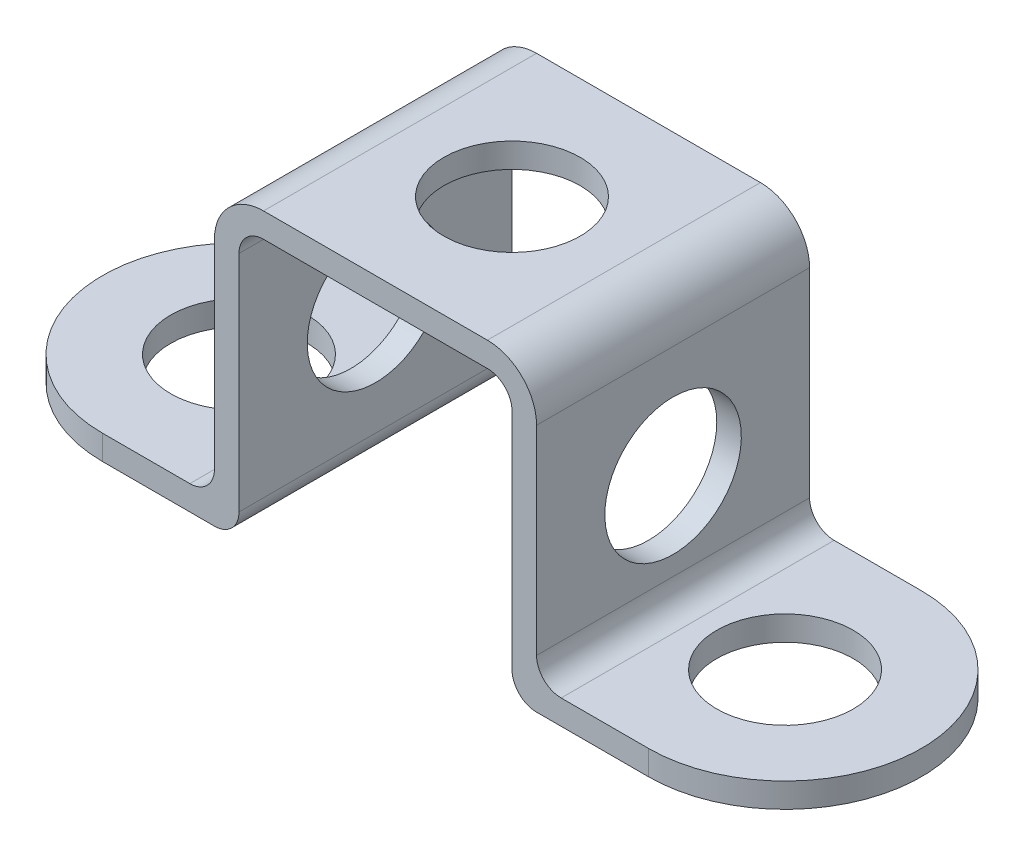
ISO-10303-21;
HEADER;
FILE_DESCRIPTION(('STEP AP214'),'2;1');
FILE_NAME('part.step','',(''),(''),'','','');
FILE_SCHEMA(('AUTOMOTIVE_DESIGN { 1 0 10303 214 1 1 1 1 }'));
ENDSEC;
DATA;
#1=APPLICATION_CONTEXT('core data for automotive mechanical design processes');
#2=APPLICATION_PROTOCOL_DEFINITION('international standard','automotive_design',2000,#1);
#3=PRODUCT_CONTEXT('',#1,'mechanical');
#4=PRODUCT('Part','Part','',(#3));
#5=PRODUCT_RELATED_PRODUCT_CATEGORY('part','',(#4));
#6=PRODUCT_DEFINITION_FORMATION('','',#4);
#7=PRODUCT_DEFINITION_CONTEXT('part definition',#1,'design');
#8=PRODUCT_DEFINITION('design','',#6,#7);
#9=PRODUCT_DEFINITION_SHAPE('','',#8);
#10=(LENGTH_UNIT() NAMED_UNIT(*) SI_UNIT(.MILLI.,.METRE.));
#11=(NAMED_UNIT(*) PLANE_ANGLE_UNIT() SI_UNIT($,.RADIAN.));
#12=(NAMED_UNIT(*) SI_UNIT($,.STERADIAN.) SOLID_ANGLE_UNIT());
#13=UNCERTAINTY_MEASURE_WITH_UNIT(LENGTH_MEASURE(1.E-05),#10,'distance_accuracy_value','');
#14=(GEOMETRIC_REPRESENTATION_CONTEXT(3) GLOBAL_UNCERTAINTY_ASSIGNED_CONTEXT((#13)) GLOBAL_UNIT_ASSIGNED_CONTEXT((#10,
#11,#12)) REPRESENTATION_CONTEXT('',''));
#15=CARTESIAN_POINT('',(0.,0.,0.));
#16=DIRECTION('',(0.,0.,1.));
#17=DIRECTION('',(1.,0.,0.));
#18=AXIS2_PLACEMENT_3D('',#15,#16,#17);
#19=CARTESIAN_POINT('',(4.1,9.1,0.));
#20=DIRECTION('',(0.,0.,-1.));
#21=DIRECTION('',(-1.,0.,0.));
#22=AXIS2_PLACEMENT_3D('',#19,#20,#21);
#23=PLANE('',#22);
#24=DIRECTION('',(0.,1.,0.));
#25=VECTOR('',#24,1.);
#26=CARTESIAN_POINT('',(10.,0.,0.));
#27=LINE('',#26,#25);
#28=CARTESIAN_POINT('',(10.,0.,0.));
#29=VERTEX_POINT('',#28);
#30=CARTESIAN_POINT('',(10.,0.900000000000003,0.));
#31=VERTEX_POINT('',#30);
#32=EDGE_CURVE('E236',#29,#31,#27,.T.);
#33=ORIENTED_EDGE('',*,*,#32,.T.);
#34=DIRECTION('',(-1.,0.,0.));
#35=VECTOR('',#34,1.);
#36=CARTESIAN_POINT('',(5.90000000000001,0.9,0.));
#37=LINE('',#36,#35);
#38=CARTESIAN_POINT('',(6.80000000000001,0.9,0.));
#39=VERTEX_POINT('',#38);
#40=EDGE_CURVE('E354',#31,#39,#37,.T.);
#41=ORIENTED_EDGE('',*,*,#40,.T.);
#42=CARTESIAN_POINT('',(6.80000000000001,1.8,0.));
#43=DIRECTION('',(0.,0.,-1.));
#44=DIRECTION('',(-1.,0.,0.));
#45=AXIS2_PLACEMENT_3D('',#42,#43,#44);
#46=CIRCLE('',#45,0.9);
#47=CARTESIAN_POINT('',(5.90000000000001,1.8,0.));
#48=VERTEX_POINT('',#47);
#49=EDGE_CURVE('E290',#39,#48,#46,.T.);
#50=ORIENTED_EDGE('',*,*,#49,.T.);
#51=DIRECTION('',(0.,1.,0.));
#52=VECTOR('',#51,1.);
#53=CARTESIAN_POINT('',(5.9,9.1,0.));
#54=LINE('',#53,#52);
#55=CARTESIAN_POINT('',(5.9,9.1,0.));
#56=VERTEX_POINT('',#55);
#57=EDGE_CURVE('E356',#48,#56,#54,.T.);
#58=ORIENTED_EDGE('',*,*,#57,.T.);
#59=CARTESIAN_POINT('',(4.1,9.1,0.));
#60=DIRECTION('',(0.,0.,1.));
#61=DIRECTION('',(-1.,0.,0.));
#62=AXIS2_PLACEMENT_3D('',#59,#60,#61);
#63=CIRCLE('',#62,1.8);
#64=CARTESIAN_POINT('',(4.09999999999999,10.9,0.));
#65=VERTEX_POINT('',#64);
#66=EDGE_CURVE('E359',#56,#65,#63,.T.);
#67=ORIENTED_EDGE('',*,*,#66,.T.);
#68=DIRECTION('',(-1.,0.,0.));
#69=VECTOR('',#68,1.);
#70=CARTESIAN_POINT('',(-4.09999999999999,10.9,0.));
#71=LINE('',#70,#69);
#72=CARTESIAN_POINT('',(-4.09999999999999,10.9,0.));
#73=VERTEX_POINT('',#72);
#74=EDGE_CURVE('E362',#65,#73,#71,.T.);
#75=ORIENTED_EDGE('',*,*,#74,.T.);
#76=CARTESIAN_POINT('',(-4.1,9.1,0.));
#77=DIRECTION('',(0.,0.,1.));
#78=DIRECTION('',(1.,0.,0.));
#79=AXIS2_PLACEMENT_3D('',#76,#77,#78);
#80=CIRCLE('',#79,1.8);
#81=CARTESIAN_POINT('',(-5.9,9.09999999999999,0.));
#82=VERTEX_POINT('',#81);
#83=EDGE_CURVE('E365',#73,#82,#80,.T.);
#84=ORIENTED_EDGE('',*,*,#83,.T.);
#85=DIRECTION('',(0.,-1.,0.));
#86=VECTOR('',#85,1.);
#87=CARTESIAN_POINT('',(-5.9,9.09999999999999,0.));
#88=LINE('',#87,#86);
#89=CARTESIAN_POINT('',(-5.9,1.80000000000001,0.));
#90=VERTEX_POINT('',#89);
#91=EDGE_CURVE('E301',#82,#90,#88,.T.);
#92=ORIENTED_EDGE('',*,*,#91,.T.);
#93=CARTESIAN_POINT('',(-6.8,1.80000000000001,0.));
#94=DIRECTION('',(0.,0.,-1.));
#95=DIRECTION('',(-1.,0.,0.));
#96=AXIS2_PLACEMENT_3D('',#93,#94,#95);
#97=CIRCLE('',#96,0.9);
#98=CARTESIAN_POINT('',(-6.8,0.900000000000006,0.));
#99=VERTEX_POINT('',#98);
#100=EDGE_CURVE('E97',#90,#99,#97,.T.);
#101=ORIENTED_EDGE('',*,*,#100,.T.);
#102=DIRECTION('',(-1.,0.,0.));
#103=VECTOR('',#102,1.);
#104=CARTESIAN_POINT('',(-5.9,0.900000000000007,0.));
#105=LINE('',#104,#103);
#106=CARTESIAN_POINT('',(-10.,0.900000000000003,0.));
#107=VERTEX_POINT('',#106);
#108=EDGE_CURVE('E298',#99,#107,#105,.T.);
#109=ORIENTED_EDGE('',*,*,#108,.T.);
#110=DIRECTION('',(0.,1.,0.));
#111=VECTOR('',#110,1.);
#112=CARTESIAN_POINT('',(-10.,0.,0.));
#113=LINE('',#112,#111);
#114=CARTESIAN_POINT('',(-10.,0.,0.));
#115=VERTEX_POINT('',#114);
#116=EDGE_CURVE('E399',#115,#107,#113,.T.);
#117=ORIENTED_EDGE('',*,*,#116,.F.);
#118=DIRECTION('',(1.,0.,0.));
#119=VECTOR('',#118,1.);
#120=CARTESIAN_POINT('',(-5.90000000000001,0.,0.));
#121=LINE('',#120,#119);
#122=CARTESIAN_POINT('',(-5.90000000000001,0.,0.));
#123=VERTEX_POINT('',#122);
#124=EDGE_CURVE('E309',#115,#123,#121,.T.);
#125=ORIENTED_EDGE('',*,*,#124,.T.);
#126=CARTESIAN_POINT('',(-5.9,0.9,0.));
#127=DIRECTION('',(0.,0.,1.));
#128=DIRECTION('',(-1.,0.,0.));
#129=AXIS2_PLACEMENT_3D('',#126,#127,#128);
#130=CIRCLE('',#129,0.9);
#131=CARTESIAN_POINT('',(-5.,0.900000000000006,0.));
#132=VERTEX_POINT('',#131);
#133=EDGE_CURVE('E369',#123,#132,#130,.T.);
#134=ORIENTED_EDGE('',*,*,#133,.T.);
#135=DIRECTION('',(0.,1.,0.));
#136=VECTOR('',#135,1.);
#137=CARTESIAN_POINT('',(-5.,9.09999999999999,0.));
#138=LINE('',#137,#136);
#139=CARTESIAN_POINT('',(-5.,9.09999999999999,0.));
#140=VERTEX_POINT('',#139);
#141=EDGE_CURVE('E372',#132,#140,#138,.T.);
#142=ORIENTED_EDGE('',*,*,#141,.T.);
#143=CARTESIAN_POINT('',(-4.1,9.1,0.));
#144=DIRECTION('',(0.,0.,-1.));
#145=DIRECTION('',(1.,0.,0.));
#146=AXIS2_PLACEMENT_3D('',#143,#144,#145);
#147=CIRCLE('',#146,0.9);
#148=CARTESIAN_POINT('',(-4.09999999999999,10.,0.));
#149=VERTEX_POINT('',#148);
#150=EDGE_CURVE('E375',#140,#149,#147,.T.);
#151=ORIENTED_EDGE('',*,*,#150,.T.);
#152=DIRECTION('',(1.,0.,0.));
#153=VECTOR('',#152,1.);
#154=CARTESIAN_POINT('',(-4.09999999999999,10.,0.));
#155=LINE('',#154,#153);
#156=CARTESIAN_POINT('',(4.09999999999999,10.,0.));
#157=VERTEX_POINT('',#156);
#158=EDGE_CURVE('E378',#149,#157,#155,.T.);
#159=ORIENTED_EDGE('',*,*,#158,.T.);
#160=CARTESIAN_POINT('',(4.1,9.1,0.));
#161=DIRECTION('',(0.,0.,-1.));
#162=DIRECTION('',(-1.,0.,0.));
#163=AXIS2_PLACEMENT_3D('',#160,#161,#162);
#164=CIRCLE('',#163,0.9);
#165=CARTESIAN_POINT('',(5.,9.1,0.));
#166=VERTEX_POINT('',#165);
#167=EDGE_CURVE('E381',#157,#166,#164,.T.);
#168=ORIENTED_EDGE('',*,*,#167,.T.);
#169=DIRECTION('',(0.,-1.,0.));
#170=VECTOR('',#169,1.);
#171=CARTESIAN_POINT('',(5.,9.1,0.));
#172=LINE('',#171,#170);
#173=CARTESIAN_POINT('',(5.,0.900000000000006,0.));
#174=VERTEX_POINT('',#173);
#175=EDGE_CURVE('E250',#166,#174,#172,.T.);
#176=ORIENTED_EDGE('',*,*,#175,.T.);
#177=CARTESIAN_POINT('',(5.9,0.9,0.));
#178=DIRECTION('',(0.,0.,1.));
#179=DIRECTION('',(1.,0.,0.));
#180=AXIS2_PLACEMENT_3D('',#177,#178,#179);
#181=CIRCLE('',#180,0.9);
#182=CARTESIAN_POINT('',(5.90000000000001,0.,0.));
#183=VERTEX_POINT('',#182);
#184=EDGE_CURVE('E245',#174,#183,#181,.T.);
#185=ORIENTED_EDGE('',*,*,#184,.T.);
#186=DIRECTION('',(1.,0.,0.));
#187=VECTOR('',#186,1.);
#188=CARTESIAN_POINT('',(5.90000000000001,0.,0.));
#189=LINE('',#188,#187);
#190=EDGE_CURVE('E230',#183,#29,#189,.T.);
#191=ORIENTED_EDGE('',*,*,#190,.T.);
#192=EDGE_LOOP('',(#33,#41,#50,#58,#67,#75,#84,#92,#101,#109,#117,#125,#134,#142,#151,#159,#168,
#176,#185,#191));
#193=FACE_BOUND('',#192,.T.);
#194=ADVANCED_FACE('F89',(#193),#23,.F.);
#195=CARTESIAN_POINT('',(4.1,9.1,-10.));
#196=DIRECTION('',(0.,0.,-1.));
#197=DIRECTION('',(-1.,0.,0.));
#198=AXIS2_PLACEMENT_3D('',#195,#196,#197);
#199=PLANE('',#198);
#200=DIRECTION('',(-1.,0.,0.));
#201=VECTOR('',#200,1.);
#202=CARTESIAN_POINT('',(5.90000000000001,0.9,-10.));
#203=LINE('',#202,#201);
#204=CARTESIAN_POINT('',(10.,0.9,-10.));
#205=VERTEX_POINT('',#204);
#206=CARTESIAN_POINT('',(6.80000000000001,0.9,-10.));
#207=VERTEX_POINT('',#206);
#208=EDGE_CURVE('E246',#205,#207,#203,.T.);
#209=ORIENTED_EDGE('',*,*,#208,.F.);
#210=DIRECTION('',(0.,1.,0.));
#211=VECTOR('',#210,1.);
#212=CARTESIAN_POINT('',(10.,0.,-10.));
#213=LINE('',#212,#211);
#214=CARTESIAN_POINT('',(10.,0.,-10.));
#215=VERTEX_POINT('',#214);
#216=EDGE_CURVE('E104',#215,#205,#213,.T.);
#217=ORIENTED_EDGE('',*,*,#216,.F.);
#218=DIRECTION('',(1.,0.,0.));
#219=VECTOR('',#218,1.);
#220=CARTESIAN_POINT('',(5.90000000000001,0.,-10.));
#221=LINE('',#220,#219);
#222=CARTESIAN_POINT('',(5.90000000000001,0.,-10.));
#223=VERTEX_POINT('',#222);
#224=EDGE_CURVE('E232',#223,#215,#221,.T.);
#225=ORIENTED_EDGE('',*,*,#224,.F.);
#226=CARTESIAN_POINT('',(5.9,0.9,-10.));
#227=DIRECTION('',(0.,0.,1.));
#228=DIRECTION('',(1.,0.,0.));
#229=AXIS2_PLACEMENT_3D('',#226,#227,#228);
#230=CIRCLE('',#229,0.9);
#231=CARTESIAN_POINT('',(5.,0.900000000000006,-10.));
#232=VERTEX_POINT('',#231);
#233=EDGE_CURVE('E350',#232,#223,#230,.T.);
#234=ORIENTED_EDGE('',*,*,#233,.F.);
#235=DIRECTION('',(0.,-1.,0.));
#236=VECTOR('',#235,1.);
#237=CARTESIAN_POINT('',(5.,9.1,-10.));
#238=LINE('',#237,#236);
#239=CARTESIAN_POINT('',(5.,9.1,-10.));
#240=VERTEX_POINT('',#239);
#241=EDGE_CURVE('E347',#240,#232,#238,.T.);
#242=ORIENTED_EDGE('',*,*,#241,.F.);
#243=CARTESIAN_POINT('',(4.1,9.1,-10.));
#244=DIRECTION('',(0.,0.,-1.));
#245=DIRECTION('',(-1.,0.,0.));
#246=AXIS2_PLACEMENT_3D('',#243,#244,#245);
#247=CIRCLE('',#246,0.9);
#248=CARTESIAN_POINT('',(4.09999999999999,10.,-10.));
#249=VERTEX_POINT('',#248);
#250=EDGE_CURVE('E344',#249,#240,#247,.T.);
#251=ORIENTED_EDGE('',*,*,#250,.F.);
#252=DIRECTION('',(1.,0.,0.));
#253=VECTOR('',#252,1.);
#254=CARTESIAN_POINT('',(-4.09999999999999,10.,-10.));
#255=LINE('',#254,#253);
#256=CARTESIAN_POINT('',(-4.09999999999999,10.,-10.));
#257=VERTEX_POINT('',#256);
#258=EDGE_CURVE('E341',#257,#249,#255,.T.);
#259=ORIENTED_EDGE('',*,*,#258,.F.);
#260=CARTESIAN_POINT('',(-4.1,9.1,-10.));
#261=DIRECTION('',(0.,0.,-1.));
#262=DIRECTION('',(1.,0.,0.));
#263=AXIS2_PLACEMENT_3D('',#260,#261,#262);
#264=CIRCLE('',#263,0.9);
#265=CARTESIAN_POINT('',(-5.,9.09999999999999,-10.));
#266=VERTEX_POINT('',#265);
#267=EDGE_CURVE('E338',#266,#257,#264,.T.);
#268=ORIENTED_EDGE('',*,*,#267,.F.);
#269=DIRECTION('',(0.,1.,0.));
#270=VECTOR('',#269,1.);
#271=CARTESIAN_POINT('',(-5.,9.09999999999999,-10.));
#272=LINE('',#271,#270);
#273=CARTESIAN_POINT('',(-5.,0.900000000000006,-10.));
#274=VERTEX_POINT('',#273);
#275=EDGE_CURVE('E335',#274,#266,#272,.T.);
#276=ORIENTED_EDGE('',*,*,#275,.F.);
#277=CARTESIAN_POINT('',(-5.9,0.9,-10.));
#278=DIRECTION('',(0.,0.,1.));
#279=DIRECTION('',(-1.,0.,0.));
#280=AXIS2_PLACEMENT_3D('',#277,#278,#279);
#281=CIRCLE('',#280,0.9);
#282=CARTESIAN_POINT('',(-5.90000000000001,0.,-10.));
#283=VERTEX_POINT('',#282);
#284=EDGE_CURVE('E332',#283,#274,#281,.T.);
#285=ORIENTED_EDGE('',*,*,#284,.F.);
#286=DIRECTION('',(1.,0.,0.));
#287=VECTOR('',#286,1.);
#288=CARTESIAN_POINT('',(-5.90000000000001,0.,-10.));
#289=LINE('',#288,#287);
#290=CARTESIAN_POINT('',(-10.,0.,-10.));
#291=VERTEX_POINT('',#290);
#292=EDGE_CURVE('E325',#291,#283,#289,.T.);
#293=ORIENTED_EDGE('',*,*,#292,.F.);
#294=DIRECTION('',(0.,1.,0.));
#295=VECTOR('',#294,1.);
#296=CARTESIAN_POINT('',(-10.,0.,-10.));
#297=LINE('',#296,#295);
#298=CARTESIAN_POINT('',(-10.,0.900000000000004,-10.));
#299=VERTEX_POINT('',#298);
#300=EDGE_CURVE('E404',#291,#299,#297,.T.);
#301=ORIENTED_EDGE('',*,*,#300,.T.);
#302=DIRECTION('',(-1.,0.,0.));
#303=VECTOR('',#302,1.);
#304=CARTESIAN_POINT('',(-5.9,0.900000000000007,-10.));
#305=LINE('',#304,#303);
#306=CARTESIAN_POINT('',(-6.8,0.900000000000006,-10.));
#307=VERTEX_POINT('',#306);
#308=EDGE_CURVE('E320',#307,#299,#305,.T.);
#309=ORIENTED_EDGE('',*,*,#308,.F.);
#310=CARTESIAN_POINT('',(-6.8,1.80000000000001,-10.));
#311=DIRECTION('',(0.,0.,-1.));
#312=DIRECTION('',(-1.,0.,0.));
#313=AXIS2_PLACEMENT_3D('',#310,#311,#312);
#314=CIRCLE('',#313,0.9);
#315=CARTESIAN_POINT('',(-5.9,1.80000000000001,-10.));
#316=VERTEX_POINT('',#315);
#317=EDGE_CURVE('E12',#307,#316,#314,.F.);
#318=ORIENTED_EDGE('',*,*,#317,.T.);
#319=DIRECTION('',(0.,-1.,0.));
#320=VECTOR('',#319,1.);
#321=CARTESIAN_POINT('',(-5.9,9.09999999999999,-10.));
#322=LINE('',#321,#320);
#323=CARTESIAN_POINT('',(-5.9,9.09999999999999,-10.));
#324=VERTEX_POINT('',#323);
#325=EDGE_CURVE('E318',#324,#316,#322,.T.);
#326=ORIENTED_EDGE('',*,*,#325,.F.);
#327=CARTESIAN_POINT('',(-4.1,9.1,-10.));
#328=DIRECTION('',(0.,0.,1.));
#329=DIRECTION('',(1.,0.,0.));
#330=AXIS2_PLACEMENT_3D('',#327,#328,#329);
#331=CIRCLE('',#330,1.8);
#332=CARTESIAN_POINT('',(-4.09999999999999,10.9,-10.));
#333=VERTEX_POINT('',#332);
#334=EDGE_CURVE('E323',#333,#324,#331,.T.);
#335=ORIENTED_EDGE('',*,*,#334,.F.);
#336=DIRECTION('',(-1.,0.,0.));
#337=VECTOR('',#336,1.);
#338=CARTESIAN_POINT('',(-4.09999999999999,10.9,-10.));
#339=LINE('',#338,#337);
#340=CARTESIAN_POINT('',(4.09999999999999,10.9,-10.));
#341=VERTEX_POINT('',#340);
#342=EDGE_CURVE('E327',#341,#333,#339,.T.);
#343=ORIENTED_EDGE('',*,*,#342,.F.);
#344=CARTESIAN_POINT('',(4.1,9.1,-10.));
#345=DIRECTION('',(0.,0.,1.));
#346=DIRECTION('',(-1.,0.,0.));
#347=AXIS2_PLACEMENT_3D('',#344,#345,#346);
#348=CIRCLE('',#347,1.8);
#349=CARTESIAN_POINT('',(5.9,9.1,-10.));
#350=VERTEX_POINT('',#349);
#351=EDGE_CURVE('E413',#350,#341,#348,.T.);
#352=ORIENTED_EDGE('',*,*,#351,.F.);
#353=DIRECTION('',(0.,1.,0.));
#354=VECTOR('',#353,1.);
#355=CARTESIAN_POINT('',(5.9,9.1,-10.));
#356=LINE('',#355,#354);
#357=CARTESIAN_POINT('',(5.90000000000001,1.8,-10.));
#358=VERTEX_POINT('',#357);
#359=EDGE_CURVE('E248',#358,#350,#356,.T.);
#360=ORIENTED_EDGE('',*,*,#359,.F.);
#361=CARTESIAN_POINT('',(6.80000000000001,1.8,-10.));
#362=DIRECTION('',(0.,0.,-1.));
#363=DIRECTION('',(-1.,0.,0.));
#364=AXIS2_PLACEMENT_3D('',#361,#362,#363);
#365=CIRCLE('',#364,0.9);
#366=EDGE_CURVE('E292',#358,#207,#365,.F.);
#367=ORIENTED_EDGE('',*,*,#366,.T.);
#368=EDGE_LOOP('',(#209,#217,#225,#234,#242,#251,#259,#268,#276,#285,#293,#301,#309,#318,#326,
#335,#343,#352,#360,#367));
#369=FACE_BOUND('',#368,.T.);
#370=ADVANCED_FACE('F316',(#369),#199,.T.);
#371=CARTESIAN_POINT('',(5.90000000000001,0.,-10.));
#372=DIRECTION('',(0.,-1.,0.));
#373=DIRECTION('',(1.,0.,0.));
#374=AXIS2_PLACEMENT_3D('',#371,#372,#373);
#375=PLANE('',#374);
#376=CARTESIAN_POINT('',(10.,0.,-5.));
#377=DIRECTION('',(0.,-1.,0.));
#378=DIRECTION('',(1.,0.,0.));
#379=AXIS2_PLACEMENT_3D('',#376,#377,#378);
#380=CIRCLE('',#379,5.);
#381=EDGE_CURVE('E225',#215,#29,#380,.T.);
#382=ORIENTED_EDGE('',*,*,#381,.T.);
#383=ORIENTED_EDGE('',*,*,#190,.F.);
#384=DIRECTION('',(0.,0.,1.));
#385=VECTOR('',#384,1.);
#386=CARTESIAN_POINT('',(5.90000000000001,0.,-10.));
#387=LINE('',#386,#385);
#388=EDGE_CURVE('E254',#223,#183,#387,.T.);
#389=ORIENTED_EDGE('',*,*,#388,.F.);
#390=ORIENTED_EDGE('',*,*,#224,.T.);
#391=EDGE_LOOP('',(#382,#383,#389,#390));
#392=FACE_BOUND('',#391,.T.);
#393=CARTESIAN_POINT('',(10.,0.,-5.));
#394=DIRECTION('',(0.,-1.,0.));
#395=DIRECTION('',(1.,0.,0.));
#396=AXIS2_PLACEMENT_3D('',#393,#394,#395);
#397=CIRCLE('',#396,2.5);
#398=CARTESIAN_POINT('',(12.5,0.,-5.));
#399=VERTEX_POINT('',#398);
#400=EDGE_CURVE('E394',#399,#399,#397,.T.);
#401=ORIENTED_EDGE('',*,*,#400,.F.);
#402=EDGE_LOOP('',(#401));
#403=FACE_BOUND('',#402,.T.);
#404=ADVANCED_FACE('F227',(#392,#403),#375,.T.);
#405=CARTESIAN_POINT('',(5.90000000000001,0.9,-10.));
#406=DIRECTION('',(0.,1.,0.));
#407=DIRECTION('',(0.,0.,1.));
#408=AXIS2_PLACEMENT_3D('',#405,#406,#407);
#409=PLANE('',#408);
#410=ORIENTED_EDGE('',*,*,#40,.F.);
#411=CARTESIAN_POINT('',(10.,0.900000000000003,-5.));
#412=DIRECTION('',(0.,-1.,0.));
#413=DIRECTION('',(1.,0.,0.));
#414=AXIS2_PLACEMENT_3D('',#411,#412,#413);
#415=CIRCLE('',#414,5.);
#416=EDGE_CURVE('E233',#205,#31,#415,.T.);
#417=ORIENTED_EDGE('',*,*,#416,.F.);
#418=ORIENTED_EDGE('',*,*,#208,.T.);
#419=DIRECTION('',(0.,0.,1.));
#420=VECTOR('',#419,1.);
#421=CARTESIAN_POINT('',(6.80000000000001,0.9,0.));
#422=LINE('',#421,#420);
#423=EDGE_CURVE('E256',#207,#39,#422,.T.);
#424=ORIENTED_EDGE('',*,*,#423,.T.);
#425=EDGE_LOOP('',(#410,#417,#418,#424));
#426=FACE_BOUND('',#425,.T.);
#427=CARTESIAN_POINT('',(10.,0.900000000000003,-5.));
#428=DIRECTION('',(0.,-1.,0.));
#429=DIRECTION('',(1.,0.,0.));
#430=AXIS2_PLACEMENT_3D('',#427,#428,#429);
#431=CIRCLE('',#430,2.5);
#432=CARTESIAN_POINT('',(12.5,0.900000000000001,-5.));
#433=VERTEX_POINT('',#432);
#434=EDGE_CURVE('E391',#433,#433,#431,.T.);
#435=ORIENTED_EDGE('',*,*,#434,.T.);
#436=EDGE_LOOP('',(#435));
#437=FACE_BOUND('',#436,.T.);
#438=ADVANCED_FACE('F437',(#426,#437),#409,.T.);
#439=CARTESIAN_POINT('',(-5.90000000000001,0.,-10.));
#440=DIRECTION('',(0.,-1.,0.));
#441=DIRECTION('',(1.,0.,0.));
#442=AXIS2_PLACEMENT_3D('',#439,#440,#441);
#443=PLANE('',#442);
#444=CARTESIAN_POINT('',(-10.,0.,-5.));
#445=DIRECTION('',(0.,1.,0.));
#446=DIRECTION('',(-1.,0.,0.));
#447=AXIS2_PLACEMENT_3D('',#444,#445,#446);
#448=CIRCLE('',#447,2.5);
#449=CARTESIAN_POINT('',(-12.5,0.,-5.));
#450=VERTEX_POINT('',#449);
#451=EDGE_CURVE('E357',#450,#450,#448,.T.);
#452=ORIENTED_EDGE('',*,*,#451,.T.);
#453=EDGE_LOOP('',(#452));
#454=FACE_BOUND('',#453,.T.);
#455=ORIENTED_EDGE('',*,*,#124,.F.);
#456=CARTESIAN_POINT('',(-10.,0.,-5.));
#457=DIRECTION('',(0.,1.,0.));
#458=DIRECTION('',(-1.,0.,0.));
#459=AXIS2_PLACEMENT_3D('',#456,#457,#458);
#460=CIRCLE('',#459,5.);
#461=EDGE_CURVE('E402',#291,#115,#460,.T.);
#462=ORIENTED_EDGE('',*,*,#461,.F.);
#463=ORIENTED_EDGE('',*,*,#292,.T.);
#464=DIRECTION('',(0.,0.,1.));
#465=VECTOR('',#464,1.);
#466=CARTESIAN_POINT('',(-5.90000000000001,0.,-10.));
#467=LINE('',#466,#465);
#468=EDGE_CURVE('E269',#283,#123,#467,.T.);
#469=ORIENTED_EDGE('',*,*,#468,.T.);
#470=EDGE_LOOP('',(#455,#462,#463,#469));
#471=FACE_BOUND('',#470,.T.);
#472=ADVANCED_FACE('F486',(#454,#471),#443,.T.);
#473=CARTESIAN_POINT('',(-5.9,0.900000000000007,-10.));
#474=DIRECTION('',(0.,1.,0.));
#475=DIRECTION('',(-1.,0.,0.));
#476=AXIS2_PLACEMENT_3D('',#473,#474,#475);
#477=PLANE('',#476);
#478=CARTESIAN_POINT('',(-10.,0.900000000000003,-5.));
#479=DIRECTION('',(0.,1.,0.));
#480=DIRECTION('',(-1.,0.,0.));
#481=AXIS2_PLACEMENT_3D('',#478,#479,#480);
#482=CIRCLE('',#481,2.5);
#483=CARTESIAN_POINT('',(-12.5,0.900000000000001,-5.));
#484=VERTEX_POINT('',#483);
#485=EDGE_CURVE('E407',#484,#484,#482,.T.);
#486=ORIENTED_EDGE('',*,*,#485,.F.);
#487=EDGE_LOOP('',(#486));
#488=FACE_BOUND('',#487,.T.);
#489=CARTESIAN_POINT('',(-10.,0.900000000000003,-5.));
#490=DIRECTION('',(0.,1.,0.));
#491=DIRECTION('',(-1.,0.,0.));
#492=AXIS2_PLACEMENT_3D('',#489,#490,#491);
#493=CIRCLE('',#492,5.);
#494=EDGE_CURVE('E112',#299,#107,#493,.T.);
#495=ORIENTED_EDGE('',*,*,#494,.T.);
#496=ORIENTED_EDGE('',*,*,#108,.F.);
#497=DIRECTION('',(0.,0.,1.));
#498=VECTOR('',#497,1.);
#499=CARTESIAN_POINT('',(-6.8,0.900000000000006,-10.));
#500=LINE('',#499,#498);
#501=EDGE_CURVE('E288',#99,#307,#500,.F.);
#502=ORIENTED_EDGE('',*,*,#501,.T.);
#503=ORIENTED_EDGE('',*,*,#308,.T.);
#504=EDGE_LOOP('',(#495,#496,#502,#503));
#505=FACE_BOUND('',#504,.T.);
#506=ADVANCED_FACE('F306',(#488,#505),#477,.T.);
#507=CARTESIAN_POINT('',(5.9,0.9,-10.));
#508=DIRECTION('',(0.,0.,1.));
#509=DIRECTION('',(1.,0.,0.));
#510=AXIS2_PLACEMENT_3D('',#507,#508,#509);
#511=CYLINDRICAL_SURFACE('',#510,0.9);
#512=ORIENTED_EDGE('',*,*,#184,.F.);
#513=DIRECTION('',(0.,0.,1.));
#514=VECTOR('',#513,1.);
#515=CARTESIAN_POINT('',(5.,0.900000000000006,-10.));
#516=LINE('',#515,#514);
#517=EDGE_CURVE('E257',#232,#174,#516,.T.);
#518=ORIENTED_EDGE('',*,*,#517,.F.);
#519=ORIENTED_EDGE('',*,*,#233,.T.);
#520=ORIENTED_EDGE('',*,*,#388,.T.);
#521=EDGE_LOOP('',(#512,#518,#519,#520));
#522=FACE_BOUND('',#521,.T.);
#523=ADVANCED_FACE('F390',(#522),#511,.T.);
#524=CARTESIAN_POINT('',(5.,9.1,-10.));
#525=DIRECTION('',(-1.,0.,0.));
#526=DIRECTION('',(0.,-1.,0.));
#527=AXIS2_PLACEMENT_3D('',#524,#525,#526);
#528=PLANE('',#527);
#529=CARTESIAN_POINT('',(5.,5.,-5.));
#530=DIRECTION('',(-1.,0.,0.));
#531=DIRECTION('',(0.,-1.,0.));
#532=AXIS2_PLACEMENT_3D('',#529,#530,#531);
#533=CIRCLE('',#532,2.5);
#534=CARTESIAN_POINT('',(5.,2.5,-5.));
#535=VERTEX_POINT('',#534);
#536=EDGE_CURVE('E533',#535,#535,#533,.T.);
#537=ORIENTED_EDGE('',*,*,#536,.F.);
#538=EDGE_LOOP('',(#537));
#539=FACE_BOUND('',#538,.T.);
#540=ORIENTED_EDGE('',*,*,#175,.F.);
#541=DIRECTION('',(0.,0.,1.));
#542=VECTOR('',#541,1.);
#543=CARTESIAN_POINT('',(5.,9.1,-10.));
#544=LINE('',#543,#542);
#545=EDGE_CURVE('E259',#240,#166,#544,.T.);
#546=ORIENTED_EDGE('',*,*,#545,.F.);
#547=ORIENTED_EDGE('',*,*,#241,.T.);
#548=ORIENTED_EDGE('',*,*,#517,.T.);
#549=EDGE_LOOP('',(#540,#546,#547,#548));
#550=FACE_BOUND('',#549,.T.);
#551=ADVANCED_FACE('F386',(#539,#550),#528,.T.);
#552=CARTESIAN_POINT('',(4.1,9.1,-10.));
#553=DIRECTION('',(0.,0.,1.));
#554=DIRECTION('',(1.,0.,0.));
#555=AXIS2_PLACEMENT_3D('',#552,#553,#554);
#556=CYLINDRICAL_SURFACE('',#555,0.9);
#557=ORIENTED_EDGE('',*,*,#167,.F.);
#558=DIRECTION('',(0.,0.,1.));
#559=VECTOR('',#558,1.);
#560=CARTESIAN_POINT('',(4.09999999999999,10.,-10.));
#561=LINE('',#560,#559);
#562=EDGE_CURVE('E261',#249,#157,#561,.T.);
#563=ORIENTED_EDGE('',*,*,#562,.F.);
#564=ORIENTED_EDGE('',*,*,#250,.T.);
#565=ORIENTED_EDGE('',*,*,#545,.T.);
#566=EDGE_LOOP('',(#557,#563,#564,#565));
#567=FACE_BOUND('',#566,.T.);
#568=ADVANCED_FACE('F466',(#567),#556,.F.);
#569=CARTESIAN_POINT('',(-4.09999999999999,10.,-10.));
#570=DIRECTION('',(0.,-1.,0.));
#571=DIRECTION('',(1.,0.,0.));
#572=AXIS2_PLACEMENT_3D('',#569,#570,#571);
#573=PLANE('',#572);
#574=CARTESIAN_POINT('',(0.,10.,-5.));
#575=DIRECTION('',(0.,-1.,0.));
#576=DIRECTION('',(1.,0.,0.));
#577=AXIS2_PLACEMENT_3D('',#574,#575,#576);
#578=CIRCLE('',#577,2.5);
#579=CARTESIAN_POINT('',(2.5,10.,-5.));
#580=VERTEX_POINT('',#579);
#581=EDGE_CURVE('E240',#580,#580,#578,.T.);
#582=ORIENTED_EDGE('',*,*,#581,.F.);
#583=EDGE_LOOP('',(#582));
#584=FACE_BOUND('',#583,.T.);
#585=ORIENTED_EDGE('',*,*,#158,.F.);
#586=DIRECTION('',(0.,0.,1.));
#587=VECTOR('',#586,1.);
#588=CARTESIAN_POINT('',(-4.09999999999999,10.,-10.));
#589=LINE('',#588,#587);
#590=EDGE_CURVE('E263',#257,#149,#589,.T.);
#591=ORIENTED_EDGE('',*,*,#590,.F.);
#592=ORIENTED_EDGE('',*,*,#258,.T.);
#593=ORIENTED_EDGE('',*,*,#562,.T.);
#594=EDGE_LOOP('',(#585,#591,#592,#593));
#595=FACE_BOUND('',#594,.T.);
#596=ADVANCED_FACE('F470',(#584,#595),#573,.T.);
#597=CARTESIAN_POINT('',(-4.1,9.1,-10.));
#598=DIRECTION('',(0.,0.,1.));
#599=DIRECTION('',(1.,0.,0.));
#600=AXIS2_PLACEMENT_3D('',#597,#598,#599);
#601=CYLINDRICAL_SURFACE('',#600,0.9);
#602=ORIENTED_EDGE('',*,*,#150,.F.);
#603=DIRECTION('',(0.,0.,1.));
#604=VECTOR('',#603,1.);
#605=CARTESIAN_POINT('',(-5.,9.09999999999999,-10.));
#606=LINE('',#605,#604);
#607=EDGE_CURVE('E265',#266,#140,#606,.T.);
#608=ORIENTED_EDGE('',*,*,#607,.F.);
#609=ORIENTED_EDGE('',*,*,#267,.T.);
#610=ORIENTED_EDGE('',*,*,#590,.T.);
#611=EDGE_LOOP('',(#602,#608,#609,#610));
#612=FACE_BOUND('',#611,.T.);
#613=ADVANCED_FACE('F474',(#612),#601,.F.);
#614=CARTESIAN_POINT('',(-5.,9.09999999999999,-10.));
#615=DIRECTION('',(1.,0.,0.));
#616=DIRECTION('',(0.,1.,0.));
#617=AXIS2_PLACEMENT_3D('',#614,#615,#616);
#618=PLANE('',#617);
#619=CARTESIAN_POINT('',(-5.,5.,-5.));
#620=DIRECTION('',(1.,0.,0.));
#621=DIRECTION('',(0.,1.,0.));
#622=AXIS2_PLACEMENT_3D('',#619,#620,#621);
#623=CIRCLE('',#622,2.5);
#624=CARTESIAN_POINT('',(-5.,7.5,-5.));
#625=VERTEX_POINT('',#624);
#626=EDGE_CURVE('E527',#625,#625,#623,.T.);
#627=ORIENTED_EDGE('',*,*,#626,.F.);
#628=EDGE_LOOP('',(#627));
#629=FACE_BOUND('',#628,.T.);
#630=ORIENTED_EDGE('',*,*,#141,.F.);
#631=DIRECTION('',(0.,0.,1.));
#632=VECTOR('',#631,1.);
#633=CARTESIAN_POINT('',(-5.,0.900000000000006,-10.));
#634=LINE('',#633,#632);
#635=EDGE_CURVE('E267',#274,#132,#634,.T.);
#636=ORIENTED_EDGE('',*,*,#635,.F.);
#637=ORIENTED_EDGE('',*,*,#275,.T.);
#638=ORIENTED_EDGE('',*,*,#607,.T.);
#639=EDGE_LOOP('',(#630,#636,#637,#638));
#640=FACE_BOUND('',#639,.T.);
#641=ADVANCED_FACE('F478',(#629,#640),#618,.T.);
#642=CARTESIAN_POINT('',(-5.9,0.9,-10.));
#643=DIRECTION('',(0.,0.,1.));
#644=DIRECTION('',(1.,0.,0.));
#645=AXIS2_PLACEMENT_3D('',#642,#643,#644);
#646=CYLINDRICAL_SURFACE('',#645,0.9);
#647=ORIENTED_EDGE('',*,*,#133,.F.);
#648=ORIENTED_EDGE('',*,*,#468,.F.);
#649=ORIENTED_EDGE('',*,*,#284,.T.);
#650=ORIENTED_EDGE('',*,*,#635,.T.);
#651=EDGE_LOOP('',(#647,#648,#649,#650));
#652=FACE_BOUND('',#651,.T.);
#653=ADVANCED_FACE('F449',(#652),#646,.T.);
#654=CARTESIAN_POINT('',(-5.9,9.09999999999999,-10.));
#655=DIRECTION('',(-1.,0.,0.));
#656=DIRECTION('',(0.,0.,1.));
#657=AXIS2_PLACEMENT_3D('',#654,#655,#656);
#658=PLANE('',#657);
#659=CARTESIAN_POINT('',(-5.9,5.,-5.));
#660=DIRECTION('',(-1.,0.,0.));
#661=DIRECTION('',(0.,0.,1.));
#662=AXIS2_PLACEMENT_3D('',#659,#660,#661);
#663=CIRCLE('',#662,2.5);
#664=CARTESIAN_POINT('',(-5.9,5.,-2.5));
#665=VERTEX_POINT('',#664);
#666=EDGE_CURVE('E530',#665,#665,#663,.T.);
#667=ORIENTED_EDGE('',*,*,#666,.F.);
#668=EDGE_LOOP('',(#667));
#669=FACE_BOUND('',#668,.T.);
#670=ORIENTED_EDGE('',*,*,#325,.T.);
#671=DIRECTION('',(0.,0.,1.));
#672=VECTOR('',#671,1.);
#673=CARTESIAN_POINT('',(-5.9,1.80000000000001,0.));
#674=LINE('',#673,#672);
#675=EDGE_CURVE('E285',#316,#90,#674,.T.);
#676=ORIENTED_EDGE('',*,*,#675,.T.);
#677=ORIENTED_EDGE('',*,*,#91,.F.);
#678=DIRECTION('',(0.,0.,1.));
#679=VECTOR('',#678,1.);
#680=CARTESIAN_POINT('',(-5.9,9.09999999999999,-10.));
#681=LINE('',#680,#679);
#682=EDGE_CURVE('E272',#324,#82,#681,.T.);
#683=ORIENTED_EDGE('',*,*,#682,.F.);
#684=EDGE_LOOP('',(#670,#676,#677,#683));
#685=FACE_BOUND('',#684,.T.);
#686=ADVANCED_FACE('F322',(#669,#685),#658,.T.);
#687=CARTESIAN_POINT('',(-4.1,9.1,-10.));
#688=DIRECTION('',(0.,0.,1.));
#689=DIRECTION('',(1.,0.,0.));
#690=AXIS2_PLACEMENT_3D('',#687,#688,#689);
#691=CYLINDRICAL_SURFACE('',#690,1.8);
#692=ORIENTED_EDGE('',*,*,#83,.F.);
#693=DIRECTION('',(0.,0.,1.));
#694=VECTOR('',#693,1.);
#695=CARTESIAN_POINT('',(-4.09999999999999,10.9,-10.));
#696=LINE('',#695,#694);
#697=EDGE_CURVE('E274',#333,#73,#696,.T.);
#698=ORIENTED_EDGE('',*,*,#697,.F.);
#699=ORIENTED_EDGE('',*,*,#334,.T.);
#700=ORIENTED_EDGE('',*,*,#682,.T.);
#701=EDGE_LOOP('',(#692,#698,#699,#700));
#702=FACE_BOUND('',#701,.T.);
#703=ADVANCED_FACE('F440',(#702),#691,.T.);
#704=CARTESIAN_POINT('',(-4.09999999999999,10.9,-10.));
#705=DIRECTION('',(0.,1.,0.));
#706=DIRECTION('',(-1.,0.,0.));
#707=AXIS2_PLACEMENT_3D('',#704,#705,#706);
#708=PLANE('',#707);
#709=CARTESIAN_POINT('',(0.,10.9,-5.));
#710=DIRECTION('',(0.,1.,0.));
#711=DIRECTION('',(-1.,0.,0.));
#712=AXIS2_PLACEMENT_3D('',#709,#710,#711);
#713=CIRCLE('',#712,2.5);
#714=CARTESIAN_POINT('',(-2.50000000000001,10.9,-5.));
#715=VERTEX_POINT('',#714);
#716=EDGE_CURVE('E540',#715,#715,#713,.T.);
#717=ORIENTED_EDGE('',*,*,#716,.F.);
#718=EDGE_LOOP('',(#717));
#719=FACE_BOUND('',#718,.T.);
#720=ORIENTED_EDGE('',*,*,#74,.F.);
#721=DIRECTION('',(0.,0.,1.));
#722=VECTOR('',#721,1.);
#723=CARTESIAN_POINT('',(4.09999999999999,10.9,-10.));
#724=LINE('',#723,#722);
#725=EDGE_CURVE('E276',#341,#65,#724,.T.);
#726=ORIENTED_EDGE('',*,*,#725,.F.);
#727=ORIENTED_EDGE('',*,*,#342,.T.);
#728=ORIENTED_EDGE('',*,*,#697,.T.);
#729=EDGE_LOOP('',(#720,#726,#727,#728));
#730=FACE_BOUND('',#729,.T.);
#731=ADVANCED_FACE('F419',(#719,#730),#708,.T.);
#732=CARTESIAN_POINT('',(4.1,9.1,-10.));
#733=DIRECTION('',(0.,0.,1.));
#734=DIRECTION('',(1.,0.,0.));
#735=AXIS2_PLACEMENT_3D('',#732,#733,#734);
#736=CYLINDRICAL_SURFACE('',#735,1.8);
#737=ORIENTED_EDGE('',*,*,#66,.F.);
#738=DIRECTION('',(0.,0.,1.));
#739=VECTOR('',#738,1.);
#740=CARTESIAN_POINT('',(5.9,9.1,-10.));
#741=LINE('',#740,#739);
#742=EDGE_CURVE('E278',#350,#56,#741,.T.);
#743=ORIENTED_EDGE('',*,*,#742,.F.);
#744=ORIENTED_EDGE('',*,*,#351,.T.);
#745=ORIENTED_EDGE('',*,*,#725,.T.);
#746=EDGE_LOOP('',(#737,#743,#744,#745));
#747=FACE_BOUND('',#746,.T.);
#748=ADVANCED_FACE('F426',(#747),#736,.T.);
#749=CARTESIAN_POINT('',(5.9,9.1,-10.));
#750=DIRECTION('',(1.,0.,0.));
#751=DIRECTION('',(0.,1.,0.));
#752=AXIS2_PLACEMENT_3D('',#749,#750,#751);
#753=PLANE('',#752);
#754=CARTESIAN_POINT('',(5.9,5.,-5.));
#755=DIRECTION('',(1.,0.,0.));
#756=DIRECTION('',(0.,1.,0.));
#757=AXIS2_PLACEMENT_3D('',#754,#755,#756);
#758=CIRCLE('',#757,2.5);
#759=CARTESIAN_POINT('',(5.9,7.50000000000001,-5.));
#760=VERTEX_POINT('',#759);
#761=EDGE_CURVE('E531',#760,#760,#758,.T.);
#762=ORIENTED_EDGE('',*,*,#761,.F.);
#763=EDGE_LOOP('',(#762));
#764=FACE_BOUND('',#763,.T.);
#765=ORIENTED_EDGE('',*,*,#57,.F.);
#766=DIRECTION('',(0.,0.,1.));
#767=VECTOR('',#766,1.);
#768=CARTESIAN_POINT('',(5.90000000000001,1.8,-10.));
#769=LINE('',#768,#767);
#770=EDGE_CURVE('E283',#48,#358,#769,.F.);
#771=ORIENTED_EDGE('',*,*,#770,.T.);
#772=ORIENTED_EDGE('',*,*,#359,.T.);
#773=ORIENTED_EDGE('',*,*,#742,.T.);
#774=EDGE_LOOP('',(#765,#771,#772,#773));
#775=FACE_BOUND('',#774,.T.);
#776=ADVANCED_FACE('F429',(#764,#775),#753,.T.);
#777=CARTESIAN_POINT('',(6.80000000000001,1.8,-10.));
#778=DIRECTION('',(0.,0.,-1.));
#779=DIRECTION('',(-1.,0.,0.));
#780=AXIS2_PLACEMENT_3D('',#777,#778,#779);
#781=CYLINDRICAL_SURFACE('',#780,0.9);
#782=ORIENTED_EDGE('',*,*,#366,.F.);
#783=ORIENTED_EDGE('',*,*,#770,.F.);
#784=ORIENTED_EDGE('',*,*,#49,.F.);
#785=ORIENTED_EDGE('',*,*,#423,.F.);
#786=EDGE_LOOP('',(#782,#783,#784,#785));
#787=FACE_BOUND('',#786,.T.);
#788=ADVANCED_FACE('F434',(#787),#781,.F.);
#789=CARTESIAN_POINT('',(-6.8,1.80000000000001,-10.));
#790=DIRECTION('',(0.,0.,-1.));
#791=DIRECTION('',(-1.,0.,0.));
#792=AXIS2_PLACEMENT_3D('',#789,#790,#791);
#793=CYLINDRICAL_SURFACE('',#792,0.9);
#794=ORIENTED_EDGE('',*,*,#317,.F.);
#795=ORIENTED_EDGE('',*,*,#501,.F.);
#796=ORIENTED_EDGE('',*,*,#100,.F.);
#797=ORIENTED_EDGE('',*,*,#675,.F.);
#798=EDGE_LOOP('',(#794,#795,#796,#797));
#799=FACE_BOUND('',#798,.T.);
#800=ADVANCED_FACE('F91',(#799),#793,.F.);
#801=CARTESIAN_POINT('',(-10.,0.,-5.));
#802=DIRECTION('',(0.,1.,0.));
#803=DIRECTION('',(-1.,0.,0.));
#804=AXIS2_PLACEMENT_3D('',#801,#802,#803);
#805=CYLINDRICAL_SURFACE('',#804,5.);
#806=ORIENTED_EDGE('',*,*,#494,.F.);
#807=ORIENTED_EDGE('',*,*,#300,.F.);
#808=ORIENTED_EDGE('',*,*,#461,.T.);
#809=ORIENTED_EDGE('',*,*,#116,.T.);
#810=EDGE_LOOP('',(#806,#807,#808,#809));
#811=FACE_BOUND('',#810,.T.);
#812=ADVANCED_FACE('F499',(#811),#805,.T.);
#813=CARTESIAN_POINT('',(-10.,0.,-5.));
#814=DIRECTION('',(0.,1.,0.));
#815=DIRECTION('',(-1.,0.,0.));
#816=AXIS2_PLACEMENT_3D('',#813,#814,#815);
#817=CYLINDRICAL_SURFACE('',#816,2.5);
#818=ORIENTED_EDGE('',*,*,#451,.F.);
#819=EDGE_LOOP('',(#818));
#820=FACE_BOUND('',#819,.T.);
#821=ORIENTED_EDGE('',*,*,#485,.T.);
#822=EDGE_LOOP('',(#821));
#823=FACE_BOUND('',#822,.T.);
#824=ADVANCED_FACE('F496',(#820,#823),#817,.F.);
#825=CARTESIAN_POINT('',(10.,0.,-5.));
#826=DIRECTION('',(0.,1.,0.));
#827=DIRECTION('',(-1.,0.,0.));
#828=AXIS2_PLACEMENT_3D('',#825,#826,#827);
#829=CYLINDRICAL_SURFACE('',#828,2.5);
#830=ORIENTED_EDGE('',*,*,#400,.T.);
#831=EDGE_LOOP('',(#830));
#832=FACE_BOUND('',#831,.T.);
#833=ORIENTED_EDGE('',*,*,#434,.F.);
#834=EDGE_LOOP('',(#833));
#835=FACE_BOUND('',#834,.T.);
#836=ADVANCED_FACE('F498',(#832,#835),#829,.F.);
#837=CARTESIAN_POINT('',(10.,0.,-5.));
#838=DIRECTION('',(0.,1.,0.));
#839=DIRECTION('',(-1.,0.,0.));
#840=AXIS2_PLACEMENT_3D('',#837,#838,#839);
#841=CYLINDRICAL_SURFACE('',#840,5.);
#842=ORIENTED_EDGE('',*,*,#416,.T.);
#843=ORIENTED_EDGE('',*,*,#32,.F.);
#844=ORIENTED_EDGE('',*,*,#381,.F.);
#845=ORIENTED_EDGE('',*,*,#216,.T.);
#846=EDGE_LOOP('',(#842,#843,#844,#845));
#847=FACE_BOUND('',#846,.T.);
#848=ADVANCED_FACE('F237',(#847),#841,.T.);
#849=CARTESIAN_POINT('',(0.,0.,-5.));
#850=DIRECTION('',(0.,1.,0.));
#851=DIRECTION('',(-1.,0.,0.));
#852=AXIS2_PLACEMENT_3D('',#849,#850,#851);
#853=CYLINDRICAL_SURFACE('',#852,2.5);
#854=ORIENTED_EDGE('',*,*,#581,.T.);
#855=EDGE_LOOP('',(#854));
#856=FACE_BOUND('',#855,.T.);
#857=ORIENTED_EDGE('',*,*,#716,.T.);
#858=EDGE_LOOP('',(#857));
#859=FACE_BOUND('',#858,.T.);
#860=ADVANCED_FACE('F512',(#856,#859),#853,.F.);
#861=CARTESIAN_POINT('',(-15.,4.99999999999999,-5.));
#862=DIRECTION('',(1.,0.,0.));
#863=DIRECTION('',(0.,1.,0.));
#864=AXIS2_PLACEMENT_3D('',#861,#862,#863);
#865=CYLINDRICAL_SURFACE('',#864,2.5);
#866=ORIENTED_EDGE('',*,*,#536,.T.);
#867=EDGE_LOOP('',(#866));
#868=FACE_BOUND('',#867,.T.);
#869=ORIENTED_EDGE('',*,*,#761,.T.);
#870=EDGE_LOOP('',(#869));
#871=FACE_BOUND('',#870,.T.);
#872=ADVANCED_FACE('F515',(#868,#871),#865,.F.);
#873=ORIENTED_EDGE('',*,*,#626,.T.);
#874=EDGE_LOOP('',(#873));
#875=FACE_BOUND('',#874,.T.);
#876=ORIENTED_EDGE('',*,*,#666,.T.);
#877=EDGE_LOOP('',(#876));
#878=FACE_BOUND('',#877,.T.);
#879=ADVANCED_FACE('F517',(#875,#878),#865,.F.);
#880=CLOSED_SHELL('',(#194,#370,#404,#438,#472,#506,#523,#551,#568,#596,#613,#641,#653,#686,
#703,#731,#748,#776,#788,#800,#812,#824,#836,#848,#860,#872,#879));
#881=MANIFOLD_SOLID_BREP('B2',#880);
#882=ADVANCED_BREP_SHAPE_REPRESENTATION('',(#18,#881),#14);
#883=SHAPE_DEFINITION_REPRESENTATION(#9,#882);
ENDSEC;
END-ISO-10303-21;
